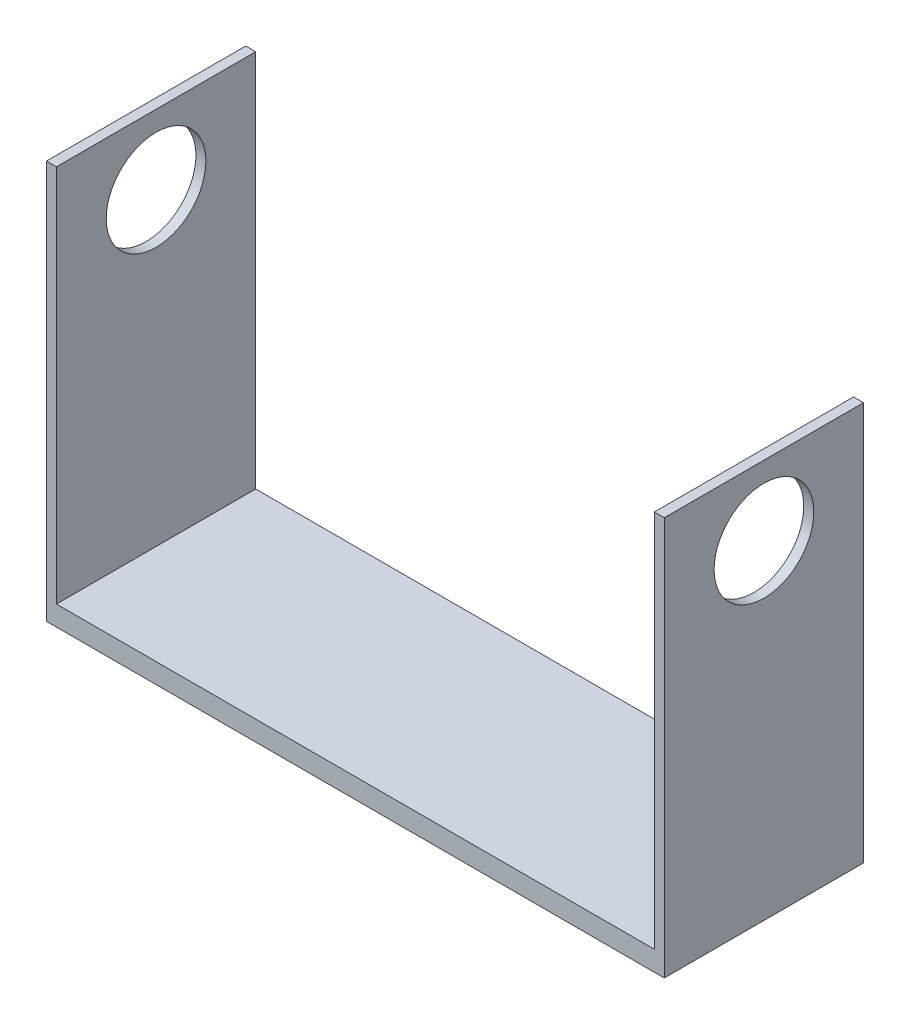
ISO-10303-21;
HEADER;
FILE_DESCRIPTION(('STEP AP214'),'2;1');
FILE_NAME('part.step','',(''),(''),'','','');
FILE_SCHEMA(('AUTOMOTIVE_DESIGN { 1 0 10303 214 1 1 1 1 }'));
ENDSEC;
DATA;
#1=APPLICATION_CONTEXT('core data for automotive mechanical design processes');
#2=APPLICATION_PROTOCOL_DEFINITION('international standard','automotive_design',2000,#1);
#3=PRODUCT_CONTEXT('',#1,'mechanical');
#4=PRODUCT('Part','Part','',(#3));
#5=PRODUCT_RELATED_PRODUCT_CATEGORY('part','',(#4));
#6=PRODUCT_DEFINITION_FORMATION('','',#4);
#7=PRODUCT_DEFINITION_CONTEXT('part definition',#1,'design');
#8=PRODUCT_DEFINITION('design','',#6,#7);
#9=PRODUCT_DEFINITION_SHAPE('','',#8);
#10=(LENGTH_UNIT() NAMED_UNIT(*) SI_UNIT(.MILLI.,.METRE.));
#11=(NAMED_UNIT(*) PLANE_ANGLE_UNIT() SI_UNIT($,.RADIAN.));
#12=(NAMED_UNIT(*) SI_UNIT($,.STERADIAN.) SOLID_ANGLE_UNIT());
#13=UNCERTAINTY_MEASURE_WITH_UNIT(LENGTH_MEASURE(1.E-05),#10,'distance_accuracy_value','');
#14=(GEOMETRIC_REPRESENTATION_CONTEXT(3) GLOBAL_UNCERTAINTY_ASSIGNED_CONTEXT((#13)) GLOBAL_UNIT_ASSIGNED_CONTEXT((#10,
#11,#12)) REPRESENTATION_CONTEXT('',''));
#15=CARTESIAN_POINT('',(0.,0.,0.));
#16=DIRECTION('',(0.,0.,1.));
#17=DIRECTION('',(1.,0.,0.));
#18=AXIS2_PLACEMENT_3D('',#15,#16,#17);
#19=CARTESIAN_POINT('',(-150.,10.,-50.));
#20=DIRECTION('',(0.,0.,1.));
#21=DIRECTION('',(1.,0.,0.));
#22=AXIS2_PLACEMENT_3D('',#19,#20,#21);
#23=PLANE('',#22);
#24=DIRECTION('',(-1.,0.,0.));
#25=VECTOR('',#24,1.);
#26=CARTESIAN_POINT('',(-150.,0.,-50.));
#27=LINE('',#26,#25);
#28=CARTESIAN_POINT('',(155.,0.,-50.0000000000001));
#29=VERTEX_POINT('',#28);
#30=CARTESIAN_POINT('',(-155.,0.,-50.));
#31=VERTEX_POINT('',#30);
#32=EDGE_CURVE('E112',#29,#31,#27,.T.);
#33=ORIENTED_EDGE('',*,*,#32,.T.);
#34=DIRECTION('',(0.,-1.,0.));
#35=VECTOR('',#34,1.);
#36=CARTESIAN_POINT('',(-155.,0.,-50.));
#37=LINE('',#36,#35);
#38=CARTESIAN_POINT('',(-155.,200.,-50.));
#39=VERTEX_POINT('',#38);
#40=EDGE_CURVE('E116',#39,#31,#37,.T.);
#41=ORIENTED_EDGE('',*,*,#40,.F.);
#42=DIRECTION('',(1.,0.,0.));
#43=VECTOR('',#42,1.);
#44=CARTESIAN_POINT('',(-155.,200.,-50.));
#45=LINE('',#44,#43);
#46=CARTESIAN_POINT('',(-150.,200.,-50.));
#47=VERTEX_POINT('',#46);
#48=EDGE_CURVE('E149',#39,#47,#45,.T.);
#49=ORIENTED_EDGE('',*,*,#48,.T.);
#50=DIRECTION('',(0.,-1.,0.));
#51=VECTOR('',#50,1.);
#52=CARTESIAN_POINT('',(-150.,0.,-50.));
#53=LINE('',#52,#51);
#54=CARTESIAN_POINT('',(-150.,10.,-50.));
#55=VERTEX_POINT('',#54);
#56=EDGE_CURVE('E150',#47,#55,#53,.T.);
#57=ORIENTED_EDGE('',*,*,#56,.T.);
#58=DIRECTION('',(-1.,0.,0.));
#59=VECTOR('',#58,1.);
#60=CARTESIAN_POINT('',(-150.,10.,-50.));
#61=LINE('',#60,#59);
#62=CARTESIAN_POINT('',(150.,10.,-50.));
#63=VERTEX_POINT('',#62);
#64=EDGE_CURVE('E194',#63,#55,#61,.T.);
#65=ORIENTED_EDGE('',*,*,#64,.F.);
#66=DIRECTION('',(0.,1.,0.));
#67=VECTOR('',#66,1.);
#68=CARTESIAN_POINT('',(150.,0.,-50.0000000000001));
#69=LINE('',#68,#67);
#70=CARTESIAN_POINT('',(150.,200.,-50.));
#71=VERTEX_POINT('',#70);
#72=EDGE_CURVE('E70',#63,#71,#69,.T.);
#73=ORIENTED_EDGE('',*,*,#72,.T.);
#74=DIRECTION('',(-1.,0.,0.));
#75=VECTOR('',#74,1.);
#76=CARTESIAN_POINT('',(155.,200.,-50.));
#77=LINE('',#76,#75);
#78=CARTESIAN_POINT('',(155.,200.,-50.));
#79=VERTEX_POINT('',#78);
#80=EDGE_CURVE('E123',#79,#71,#77,.T.);
#81=ORIENTED_EDGE('',*,*,#80,.F.);
#82=DIRECTION('',(0.,1.,0.));
#83=VECTOR('',#82,1.);
#84=CARTESIAN_POINT('',(155.,0.,-50.0000000000001));
#85=LINE('',#84,#83);
#86=EDGE_CURVE('E118',#29,#79,#85,.T.);
#87=ORIENTED_EDGE('',*,*,#86,.F.);
#88=EDGE_LOOP('',(#33,#41,#49,#57,#65,#73,#81,#87));
#89=FACE_BOUND('',#88,.T.);
#90=ADVANCED_FACE('F45',(#89),#23,.F.);
#91=CARTESIAN_POINT('',(-150.,10.,50.));
#92=DIRECTION('',(0.,0.,-1.));
#93=DIRECTION('',(-1.,0.,0.));
#94=AXIS2_PLACEMENT_3D('',#91,#92,#93);
#95=PLANE('',#94);
#96=DIRECTION('',(1.,0.,0.));
#97=VECTOR('',#96,1.);
#98=CARTESIAN_POINT('',(-150.,0.,50.));
#99=LINE('',#98,#97);
#100=CARTESIAN_POINT('',(-155.,0.,50.));
#101=VERTEX_POINT('',#100);
#102=CARTESIAN_POINT('',(155.,0.,49.9999999999999));
#103=VERTEX_POINT('',#102);
#104=EDGE_CURVE('E48',#101,#103,#99,.T.);
#105=ORIENTED_EDGE('',*,*,#104,.T.);
#106=DIRECTION('',(0.,-1.,0.));
#107=VECTOR('',#106,1.);
#108=CARTESIAN_POINT('',(155.,0.,49.9999999999999));
#109=LINE('',#108,#107);
#110=CARTESIAN_POINT('',(155.,200.,50.));
#111=VERTEX_POINT('',#110);
#112=EDGE_CURVE('E163',#111,#103,#109,.T.);
#113=ORIENTED_EDGE('',*,*,#112,.F.);
#114=DIRECTION('',(-1.,0.,0.));
#115=VECTOR('',#114,1.);
#116=CARTESIAN_POINT('',(155.,200.,50.));
#117=LINE('',#116,#115);
#118=CARTESIAN_POINT('',(150.,200.,50.));
#119=VERTEX_POINT('',#118);
#120=EDGE_CURVE('E176',#111,#119,#117,.T.);
#121=ORIENTED_EDGE('',*,*,#120,.T.);
#122=DIRECTION('',(0.,-1.,0.));
#123=VECTOR('',#122,1.);
#124=CARTESIAN_POINT('',(150.,0.,49.9999999999999));
#125=LINE('',#124,#123);
#126=CARTESIAN_POINT('',(150.,10.,49.9999999999999));
#127=VERTEX_POINT('',#126);
#128=EDGE_CURVE('E162',#119,#127,#125,.T.);
#129=ORIENTED_EDGE('',*,*,#128,.T.);
#130=DIRECTION('',(1.,0.,0.));
#131=VECTOR('',#130,1.);
#132=CARTESIAN_POINT('',(-150.,10.,50.));
#133=LINE('',#132,#131);
#134=CARTESIAN_POINT('',(-150.,10.,50.));
#135=VERTEX_POINT('',#134);
#136=EDGE_CURVE('E11',#135,#127,#133,.T.);
#137=ORIENTED_EDGE('',*,*,#136,.F.);
#138=DIRECTION('',(0.,1.,0.));
#139=VECTOR('',#138,1.);
#140=CARTESIAN_POINT('',(-150.,0.,50.));
#141=LINE('',#140,#139);
#142=CARTESIAN_POINT('',(-150.,200.,50.));
#143=VERTEX_POINT('',#142);
#144=EDGE_CURVE('E62',#135,#143,#141,.T.);
#145=ORIENTED_EDGE('',*,*,#144,.T.);
#146=DIRECTION('',(1.,0.,0.));
#147=VECTOR('',#146,1.);
#148=CARTESIAN_POINT('',(-155.,200.,50.));
#149=LINE('',#148,#147);
#150=CARTESIAN_POINT('',(-155.,200.,50.));
#151=VERTEX_POINT('',#150);
#152=EDGE_CURVE('E158',#151,#143,#149,.T.);
#153=ORIENTED_EDGE('',*,*,#152,.F.);
#154=DIRECTION('',(0.,1.,0.));
#155=VECTOR('',#154,1.);
#156=CARTESIAN_POINT('',(-155.,0.,50.));
#157=LINE('',#156,#155);
#158=EDGE_CURVE('E130',#101,#151,#157,.T.);
#159=ORIENTED_EDGE('',*,*,#158,.F.);
#160=EDGE_LOOP('',(#105,#113,#121,#129,#137,#145,#153,#159));
#161=FACE_BOUND('',#160,.T.);
#162=ADVANCED_FACE('F204',(#161),#95,.F.);
#163=CARTESIAN_POINT('',(0.,10.,0.));
#164=DIRECTION('',(0.,-1.,0.));
#165=DIRECTION('',(0.,0.,-1.));
#166=AXIS2_PLACEMENT_3D('',#163,#164,#165);
#167=PLANE('',#166);
#168=DIRECTION('',(0.,0.,-1.));
#169=VECTOR('',#168,1.);
#170=CARTESIAN_POINT('',(150.,10.,50.));
#171=LINE('',#170,#169);
#172=EDGE_CURVE('E190',#127,#63,#171,.T.);
#173=ORIENTED_EDGE('',*,*,#172,.T.);
#174=ORIENTED_EDGE('',*,*,#64,.T.);
#175=DIRECTION('',(0.,0.,1.));
#176=VECTOR('',#175,1.);
#177=CARTESIAN_POINT('',(-150.,10.,50.));
#178=LINE('',#177,#176);
#179=EDGE_CURVE('E54',#55,#135,#178,.T.);
#180=ORIENTED_EDGE('',*,*,#179,.T.);
#181=ORIENTED_EDGE('',*,*,#136,.T.);
#182=EDGE_LOOP('',(#173,#174,#180,#181));
#183=FACE_BOUND('',#182,.T.);
#184=ADVANCED_FACE('F201',(#183),#167,.F.);
#185=CARTESIAN_POINT('',(0.,0.,0.));
#186=DIRECTION('',(0.,-1.,0.));
#187=DIRECTION('',(0.,0.,-1.));
#188=AXIS2_PLACEMENT_3D('',#185,#186,#187);
#189=PLANE('',#188);
#190=ORIENTED_EDGE('',*,*,#32,.F.);
#191=DIRECTION('',(0.,0.,-1.));
#192=VECTOR('',#191,1.);
#193=CARTESIAN_POINT('',(155.,0.,49.9999999999999));
#194=LINE('',#193,#192);
#195=EDGE_CURVE('E167',#103,#29,#194,.T.);
#196=ORIENTED_EDGE('',*,*,#195,.F.);
#197=ORIENTED_EDGE('',*,*,#104,.F.);
#198=DIRECTION('',(0.,0.,1.));
#199=VECTOR('',#198,1.);
#200=CARTESIAN_POINT('',(-155.,0.,-50.));
#201=LINE('',#200,#199);
#202=EDGE_CURVE('E125',#31,#101,#201,.T.);
#203=ORIENTED_EDGE('',*,*,#202,.F.);
#204=EDGE_LOOP('',(#190,#196,#197,#203));
#205=FACE_BOUND('',#204,.T.);
#206=ADVANCED_FACE('F126',(#205),#189,.T.);
#207=CARTESIAN_POINT('',(150.,0.,0.));
#208=DIRECTION('',(-1.,0.,0.));
#209=DIRECTION('',(0.,0.,1.));
#210=AXIS2_PLACEMENT_3D('',#207,#208,#209);
#211=PLANE('',#210);
#212=CARTESIAN_POINT('',(150.,165.,0.));
#213=DIRECTION('',(-1.,0.,0.));
#214=DIRECTION('',(0.,0.,1.));
#215=AXIS2_PLACEMENT_3D('',#212,#213,#214);
#216=CIRCLE('',#215,25.);
#217=CARTESIAN_POINT('',(150.,165.,25.));
#218=VERTEX_POINT('',#217);
#219=EDGE_CURVE('E142',#218,#218,#216,.T.);
#220=ORIENTED_EDGE('',*,*,#219,.F.);
#221=EDGE_LOOP('',(#220));
#222=FACE_BOUND('',#221,.T.);
#223=ORIENTED_EDGE('',*,*,#172,.F.);
#224=ORIENTED_EDGE('',*,*,#128,.F.);
#225=DIRECTION('',(0.,0.,1.));
#226=VECTOR('',#225,1.);
#227=CARTESIAN_POINT('',(150.,200.,50.));
#228=LINE('',#227,#226);
#229=EDGE_CURVE('E168',#71,#119,#228,.T.);
#230=ORIENTED_EDGE('',*,*,#229,.F.);
#231=ORIENTED_EDGE('',*,*,#72,.F.);
#232=EDGE_LOOP('',(#223,#224,#230,#231));
#233=FACE_BOUND('',#232,.T.);
#234=ADVANCED_FACE('F209',(#222,#233),#211,.T.);
#235=CARTESIAN_POINT('',(155.,200.,50.));
#236=DIRECTION('',(0.,-1.,0.));
#237=DIRECTION('',(0.,0.,-1.));
#238=AXIS2_PLACEMENT_3D('',#235,#236,#237);
#239=PLANE('',#238);
#240=ORIENTED_EDGE('',*,*,#229,.T.);
#241=ORIENTED_EDGE('',*,*,#120,.F.);
#242=DIRECTION('',(0.,0.,1.));
#243=VECTOR('',#242,1.);
#244=CARTESIAN_POINT('',(155.,200.,50.));
#245=LINE('',#244,#243);
#246=EDGE_CURVE('E173',#79,#111,#245,.T.);
#247=ORIENTED_EDGE('',*,*,#246,.F.);
#248=ORIENTED_EDGE('',*,*,#80,.T.);
#249=EDGE_LOOP('',(#240,#241,#247,#248));
#250=FACE_BOUND('',#249,.T.);
#251=ADVANCED_FACE('F211',(#250),#239,.F.);
#252=CARTESIAN_POINT('',(155.,0.,0.));
#253=DIRECTION('',(-1.,0.,0.));
#254=DIRECTION('',(0.,0.,1.));
#255=AXIS2_PLACEMENT_3D('',#252,#253,#254);
#256=PLANE('',#255);
#257=CARTESIAN_POINT('',(155.,165.,0.));
#258=DIRECTION('',(-1.,0.,0.));
#259=DIRECTION('',(0.,0.,1.));
#260=AXIS2_PLACEMENT_3D('',#257,#258,#259);
#261=CIRCLE('',#260,25.);
#262=CARTESIAN_POINT('',(155.,165.,25.));
#263=VERTEX_POINT('',#262);
#264=EDGE_CURVE('E254',#263,#263,#261,.F.);
#265=ORIENTED_EDGE('',*,*,#264,.F.);
#266=EDGE_LOOP('',(#265));
#267=FACE_BOUND('',#266,.T.);
#268=ORIENTED_EDGE('',*,*,#112,.T.);
#269=ORIENTED_EDGE('',*,*,#195,.T.);
#270=ORIENTED_EDGE('',*,*,#86,.T.);
#271=ORIENTED_EDGE('',*,*,#246,.T.);
#272=EDGE_LOOP('',(#268,#269,#270,#271));
#273=FACE_BOUND('',#272,.T.);
#274=ADVANCED_FACE('F218',(#267,#273),#256,.F.);
#275=CARTESIAN_POINT('',(-150.,0.,0.));
#276=DIRECTION('',(1.,0.,0.));
#277=DIRECTION('',(0.,0.,-1.));
#278=AXIS2_PLACEMENT_3D('',#275,#276,#277);
#279=PLANE('',#278);
#280=CARTESIAN_POINT('',(-150.,165.,0.));
#281=DIRECTION('',(1.,0.,0.));
#282=DIRECTION('',(0.,0.,-1.));
#283=AXIS2_PLACEMENT_3D('',#280,#281,#282);
#284=CIRCLE('',#283,25.);
#285=CARTESIAN_POINT('',(-150.,165.,-25.));
#286=VERTEX_POINT('',#285);
#287=EDGE_CURVE('E251',#286,#286,#284,.T.);
#288=ORIENTED_EDGE('',*,*,#287,.F.);
#289=EDGE_LOOP('',(#288));
#290=FACE_BOUND('',#289,.T.);
#291=ORIENTED_EDGE('',*,*,#179,.F.);
#292=ORIENTED_EDGE('',*,*,#56,.F.);
#293=DIRECTION('',(0.,0.,-1.));
#294=VECTOR('',#293,1.);
#295=CARTESIAN_POINT('',(-150.,200.,-50.));
#296=LINE('',#295,#294);
#297=EDGE_CURVE('E137',#143,#47,#296,.T.);
#298=ORIENTED_EDGE('',*,*,#297,.F.);
#299=ORIENTED_EDGE('',*,*,#144,.F.);
#300=EDGE_LOOP('',(#291,#292,#298,#299));
#301=FACE_BOUND('',#300,.T.);
#302=ADVANCED_FACE('F213',(#290,#301),#279,.T.);
#303=CARTESIAN_POINT('',(-155.,200.,-50.));
#304=DIRECTION('',(0.,-1.,0.));
#305=DIRECTION('',(0.,0.,-1.));
#306=AXIS2_PLACEMENT_3D('',#303,#304,#305);
#307=PLANE('',#306);
#308=ORIENTED_EDGE('',*,*,#297,.T.);
#309=ORIENTED_EDGE('',*,*,#48,.F.);
#310=DIRECTION('',(0.,0.,-1.));
#311=VECTOR('',#310,1.);
#312=CARTESIAN_POINT('',(-155.,200.,-50.));
#313=LINE('',#312,#311);
#314=EDGE_CURVE('E134',#151,#39,#313,.T.);
#315=ORIENTED_EDGE('',*,*,#314,.F.);
#316=ORIENTED_EDGE('',*,*,#152,.T.);
#317=EDGE_LOOP('',(#308,#309,#315,#316));
#318=FACE_BOUND('',#317,.T.);
#319=ADVANCED_FACE('F215',(#318),#307,.F.);
#320=CARTESIAN_POINT('',(-155.,0.,0.));
#321=DIRECTION('',(1.,0.,0.));
#322=DIRECTION('',(0.,0.,-1.));
#323=AXIS2_PLACEMENT_3D('',#320,#321,#322);
#324=PLANE('',#323);
#325=CARTESIAN_POINT('',(-155.,165.,0.));
#326=DIRECTION('',(-1.,0.,0.));
#327=DIRECTION('',(0.,0.,1.));
#328=AXIS2_PLACEMENT_3D('',#325,#326,#327);
#329=CIRCLE('',#328,25.);
#330=CARTESIAN_POINT('',(-155.,165.,25.));
#331=VERTEX_POINT('',#330);
#332=EDGE_CURVE('E259',#331,#331,#329,.T.);
#333=ORIENTED_EDGE('',*,*,#332,.F.);
#334=EDGE_LOOP('',(#333));
#335=FACE_BOUND('',#334,.T.);
#336=ORIENTED_EDGE('',*,*,#40,.T.);
#337=ORIENTED_EDGE('',*,*,#202,.T.);
#338=ORIENTED_EDGE('',*,*,#158,.T.);
#339=ORIENTED_EDGE('',*,*,#314,.T.);
#340=EDGE_LOOP('',(#336,#337,#338,#339));
#341=FACE_BOUND('',#340,.T.);
#342=ADVANCED_FACE('F132',(#335,#341),#324,.F.);
#343=CARTESIAN_POINT('',(225.710678118655,165.,0.));
#344=DIRECTION('',(-1.,0.,0.));
#345=DIRECTION('',(0.,0.,1.));
#346=AXIS2_PLACEMENT_3D('',#343,#344,#345);
#347=CYLINDRICAL_SURFACE('',#346,25.);
#348=ORIENTED_EDGE('',*,*,#287,.T.);
#349=EDGE_LOOP('',(#348));
#350=FACE_BOUND('',#349,.T.);
#351=ORIENTED_EDGE('',*,*,#332,.T.);
#352=EDGE_LOOP('',(#351));
#353=FACE_BOUND('',#352,.T.);
#354=ADVANCED_FACE('F266',(#350,#353),#347,.F.);
#355=ORIENTED_EDGE('',*,*,#219,.T.);
#356=EDGE_LOOP('',(#355));
#357=FACE_BOUND('',#356,.T.);
#358=ORIENTED_EDGE('',*,*,#264,.T.);
#359=EDGE_LOOP('',(#358));
#360=FACE_BOUND('',#359,.T.);
#361=ADVANCED_FACE('F273',(#357,#360),#347,.F.);
#362=CLOSED_SHELL('',(#90,#162,#184,#206,#234,#251,#274,#302,#319,#342,#354,#361));
#363=MANIFOLD_SOLID_BREP('B2',#362);
#364=ADVANCED_BREP_SHAPE_REPRESENTATION('',(#18,#363),#14);
#365=SHAPE_DEFINITION_REPRESENTATION(#9,#364);
ENDSEC;
END-ISO-10303-21;
